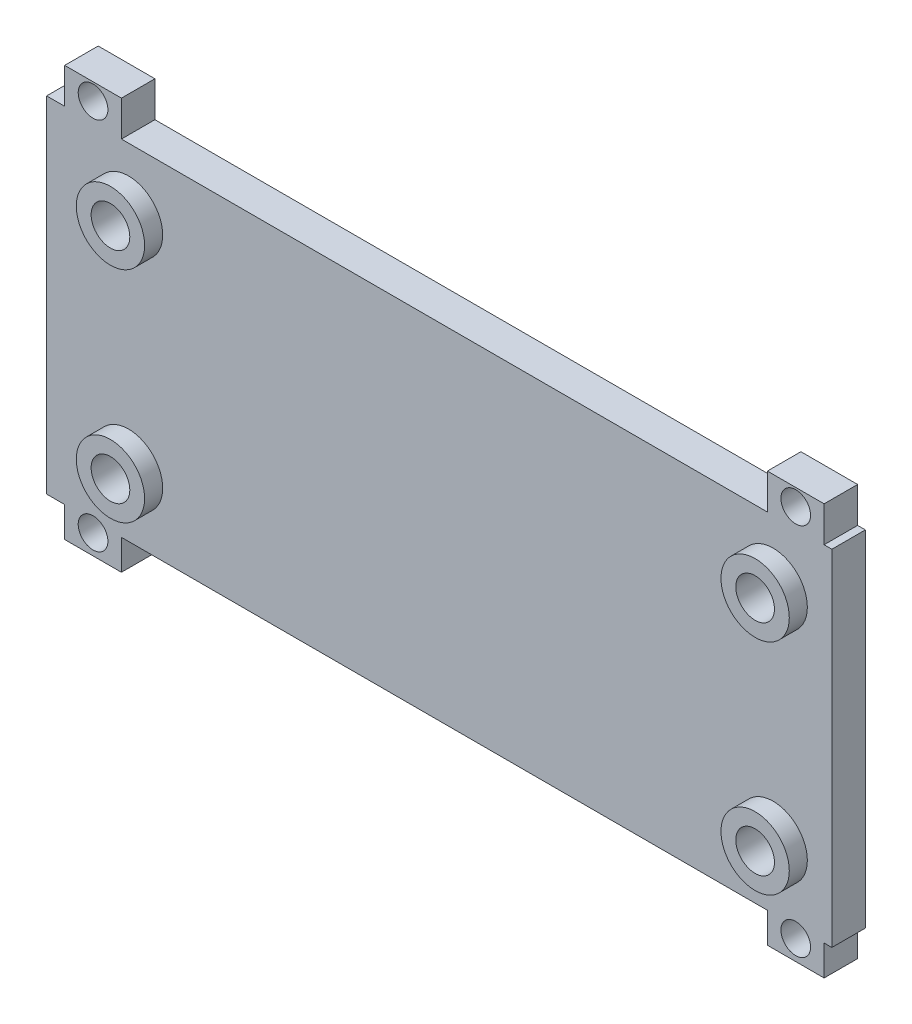
ISO-10303-21;
HEADER;
FILE_DESCRIPTION(('STEP AP214'),'2;1');
FILE_NAME('part.step','',(''),(''),'','','');
FILE_SCHEMA(('AUTOMOTIVE_DESIGN { 1 0 10303 214 1 1 1 1 }'));
ENDSEC;
DATA;
#1=APPLICATION_CONTEXT('core data for automotive mechanical design processes');
#2=APPLICATION_PROTOCOL_DEFINITION('international standard','automotive_design',2000,#1);
#3=PRODUCT_CONTEXT('',#1,'mechanical');
#4=PRODUCT('Part','Part','',(#3));
#5=PRODUCT_RELATED_PRODUCT_CATEGORY('part','',(#4));
#6=PRODUCT_DEFINITION_FORMATION('','',#4);
#7=PRODUCT_DEFINITION_CONTEXT('part definition',#1,'design');
#8=PRODUCT_DEFINITION('design','',#6,#7);
#9=PRODUCT_DEFINITION_SHAPE('','',#8);
#10=(LENGTH_UNIT() NAMED_UNIT(*) SI_UNIT(.MILLI.,.METRE.));
#11=(NAMED_UNIT(*) PLANE_ANGLE_UNIT() SI_UNIT($,.RADIAN.));
#12=(NAMED_UNIT(*) SI_UNIT($,.STERADIAN.) SOLID_ANGLE_UNIT());
#13=UNCERTAINTY_MEASURE_WITH_UNIT(LENGTH_MEASURE(1.E-05),#10,'distance_accuracy_value','');
#14=(GEOMETRIC_REPRESENTATION_CONTEXT(3) GLOBAL_UNCERTAINTY_ASSIGNED_CONTEXT((#13)) GLOBAL_UNIT_ASSIGNED_CONTEXT((#10,
#11,#12)) REPRESENTATION_CONTEXT('',''));
#15=CARTESIAN_POINT('',(0.,0.,0.));
#16=DIRECTION('',(0.,0.,1.));
#17=DIRECTION('',(1.,0.,0.));
#18=AXIS2_PLACEMENT_3D('',#15,#16,#17);
#19=CARTESIAN_POINT('',(0.,0.,2.6));
#20=DIRECTION('',(0.,0.,1.));
#21=DIRECTION('',(1.,0.,0.));
#22=AXIS2_PLACEMENT_3D('',#19,#20,#21);
#23=PLANE('',#22);
#24=CARTESIAN_POINT('',(-36.75,25.9,2.6));
#25=DIRECTION('',(0.,0.,1.));
#26=DIRECTION('',(1.,0.,0.));
#27=AXIS2_PLACEMENT_3D('',#24,#25,#26);
#28=CIRCLE('',#27,2.65);
#29=CARTESIAN_POINT('',(-34.1,25.9,2.6));
#30=VERTEX_POINT('',#29);
#31=EDGE_CURVE('E456',#30,#30,#28,.T.);
#32=ORIENTED_EDGE('',*,*,#31,.F.);
#33=EDGE_LOOP('',(#32));
#34=FACE_BOUND('',#33,.T.);
#35=CARTESIAN_POINT('',(-36.75,8.9,2.6));
#36=DIRECTION('',(0.,0.,1.));
#37=DIRECTION('',(1.,0.,0.));
#38=AXIS2_PLACEMENT_3D('',#35,#36,#37);
#39=CIRCLE('',#38,2.65);
#40=CARTESIAN_POINT('',(-34.1,8.9,2.6));
#41=VERTEX_POINT('',#40);
#42=EDGE_CURVE('E476',#41,#41,#39,.T.);
#43=ORIENTED_EDGE('',*,*,#42,.F.);
#44=EDGE_LOOP('',(#43));
#45=FACE_BOUND('',#44,.T.);
#46=CARTESIAN_POINT('',(-39.5,32.2,2.6));
#47=DIRECTION('',(0.,0.,1.));
#48=DIRECTION('',(1.,0.,0.));
#49=AXIS2_PLACEMENT_3D('',#46,#47,#48);
#50=CIRCLE('',#49,1.15);
#51=CARTESIAN_POINT('',(-38.35,32.2,2.6));
#52=VERTEX_POINT('',#51);
#53=EDGE_CURVE('E501',#52,#52,#50,.T.);
#54=ORIENTED_EDGE('',*,*,#53,.F.);
#55=EDGE_LOOP('',(#54));
#56=FACE_BOUND('',#55,.T.);
#57=CARTESIAN_POINT('',(-39.5,3.2,2.6));
#58=DIRECTION('',(0.,0.,1.));
#59=DIRECTION('',(1.,0.,0.));
#60=AXIS2_PLACEMENT_3D('',#57,#58,#59);
#61=CIRCLE('',#60,1.15);
#62=CARTESIAN_POINT('',(-38.35,3.2,2.6));
#63=VERTEX_POINT('',#62);
#64=EDGE_CURVE('E216',#63,#63,#61,.T.);
#65=ORIENTED_EDGE('',*,*,#64,.F.);
#66=EDGE_LOOP('',(#65));
#67=FACE_BOUND('',#66,.T.);
#68=DIRECTION('',(0.,-1.,0.));
#69=VECTOR('',#68,1.);
#70=CARTESIAN_POINT('',(-43.1,30.75,2.6));
#71=LINE('',#70,#69);
#72=CARTESIAN_POINT('',(-43.1,30.75,2.6));
#73=VERTEX_POINT('',#72);
#74=CARTESIAN_POINT('',(-43.1,4.,2.6));
#75=VERTEX_POINT('',#74);
#76=EDGE_CURVE('E251',#73,#75,#71,.T.);
#77=ORIENTED_EDGE('',*,*,#76,.T.);
#78=DIRECTION('',(1.,0.,0.));
#79=VECTOR('',#78,1.);
#80=CARTESIAN_POINT('',(-43.1,4.,2.6));
#81=LINE('',#80,#79);
#82=CARTESIAN_POINT('',(-41.7,4.,2.6));
#83=VERTEX_POINT('',#82);
#84=EDGE_CURVE('E139',#75,#83,#81,.T.);
#85=ORIENTED_EDGE('',*,*,#84,.T.);
#86=DIRECTION('',(0.,-1.,0.));
#87=VECTOR('',#86,1.);
#88=CARTESIAN_POINT('',(-41.7,4.,2.6));
#89=LINE('',#88,#87);
#90=CARTESIAN_POINT('',(-41.7,1.65,2.6));
#91=VERTEX_POINT('',#90);
#92=EDGE_CURVE('E302',#83,#91,#89,.T.);
#93=ORIENTED_EDGE('',*,*,#92,.T.);
#94=DIRECTION('',(1.,0.,0.));
#95=VECTOR('',#94,1.);
#96=CARTESIAN_POINT('',(-41.7,1.65,2.6));
#97=LINE('',#96,#95);
#98=CARTESIAN_POINT('',(-37.3,1.65,2.6));
#99=VERTEX_POINT('',#98);
#100=EDGE_CURVE('E321',#91,#99,#97,.T.);
#101=ORIENTED_EDGE('',*,*,#100,.T.);
#102=DIRECTION('',(0.,1.,0.));
#103=VECTOR('',#102,1.);
#104=CARTESIAN_POINT('',(-37.3,1.65,2.6));
#105=LINE('',#104,#103);
#106=CARTESIAN_POINT('',(-37.3,4.,2.6));
#107=VERTEX_POINT('',#106);
#108=EDGE_CURVE('E318',#99,#107,#105,.T.);
#109=ORIENTED_EDGE('',*,*,#108,.T.);
#110=DIRECTION('',(1.,0.,0.));
#111=VECTOR('',#110,1.);
#112=CARTESIAN_POINT('',(-37.3,4.,2.6));
#113=LINE('',#112,#111);
#114=CARTESIAN_POINT('',(12.8,4.,2.6));
#115=VERTEX_POINT('',#114);
#116=EDGE_CURVE('E320',#107,#115,#113,.T.);
#117=ORIENTED_EDGE('',*,*,#116,.T.);
#118=DIRECTION('',(0.,-1.,0.));
#119=VECTOR('',#118,1.);
#120=CARTESIAN_POINT('',(12.8,4.,2.6));
#121=LINE('',#120,#119);
#122=CARTESIAN_POINT('',(12.8,1.65,2.6));
#123=VERTEX_POINT('',#122);
#124=EDGE_CURVE('E323',#115,#123,#121,.T.);
#125=ORIENTED_EDGE('',*,*,#124,.T.);
#126=DIRECTION('',(1.,0.,0.));
#127=VECTOR('',#126,1.);
#128=CARTESIAN_POINT('',(12.8,1.65,2.6));
#129=LINE('',#128,#127);
#130=CARTESIAN_POINT('',(17.2,1.65,2.6));
#131=VERTEX_POINT('',#130);
#132=EDGE_CURVE('E329',#123,#131,#129,.T.);
#133=ORIENTED_EDGE('',*,*,#132,.T.);
#134=DIRECTION('',(0.,1.,0.));
#135=VECTOR('',#134,1.);
#136=CARTESIAN_POINT('',(17.2,1.65,2.6));
#137=LINE('',#136,#135);
#138=CARTESIAN_POINT('',(17.2,4.,2.6));
#139=VERTEX_POINT('',#138);
#140=EDGE_CURVE('E331',#131,#139,#137,.T.);
#141=ORIENTED_EDGE('',*,*,#140,.T.);
#142=DIRECTION('',(1.,0.,0.));
#143=VECTOR('',#142,1.);
#144=CARTESIAN_POINT('',(17.2,4.,2.6));
#145=LINE('',#144,#143);
#146=CARTESIAN_POINT('',(17.8,4.,2.6));
#147=VERTEX_POINT('',#146);
#148=EDGE_CURVE('E333',#139,#147,#145,.T.);
#149=ORIENTED_EDGE('',*,*,#148,.T.);
#150=DIRECTION('',(0.,1.,0.));
#151=VECTOR('',#150,1.);
#152=CARTESIAN_POINT('',(17.8,4.,2.6));
#153=LINE('',#152,#151);
#154=CARTESIAN_POINT('',(17.8,30.75,2.6));
#155=VERTEX_POINT('',#154);
#156=EDGE_CURVE('E335',#147,#155,#153,.T.);
#157=ORIENTED_EDGE('',*,*,#156,.T.);
#158=DIRECTION('',(-1.,0.,0.));
#159=VECTOR('',#158,1.);
#160=CARTESIAN_POINT('',(17.8,30.75,2.6));
#161=LINE('',#160,#159);
#162=CARTESIAN_POINT('',(17.2,30.75,2.6));
#163=VERTEX_POINT('',#162);
#164=EDGE_CURVE('E337',#155,#163,#161,.T.);
#165=ORIENTED_EDGE('',*,*,#164,.T.);
#166=DIRECTION('',(0.,1.,0.));
#167=VECTOR('',#166,1.);
#168=CARTESIAN_POINT('',(17.2,30.75,2.6));
#169=LINE('',#168,#167);
#170=CARTESIAN_POINT('',(17.2,33.5,2.6));
#171=VERTEX_POINT('',#170);
#172=EDGE_CURVE('E339',#163,#171,#169,.T.);
#173=ORIENTED_EDGE('',*,*,#172,.T.);
#174=DIRECTION('',(-1.,0.,0.));
#175=VECTOR('',#174,1.);
#176=CARTESIAN_POINT('',(17.2,33.5,2.6));
#177=LINE('',#176,#175);
#178=CARTESIAN_POINT('',(12.8,33.5,2.6));
#179=VERTEX_POINT('',#178);
#180=EDGE_CURVE('E341',#171,#179,#177,.T.);
#181=ORIENTED_EDGE('',*,*,#180,.T.);
#182=DIRECTION('',(0.,-1.,0.));
#183=VECTOR('',#182,1.);
#184=CARTESIAN_POINT('',(12.8,33.5,2.6));
#185=LINE('',#184,#183);
#186=CARTESIAN_POINT('',(12.8,30.75,2.6));
#187=VERTEX_POINT('',#186);
#188=EDGE_CURVE('E343',#179,#187,#185,.T.);
#189=ORIENTED_EDGE('',*,*,#188,.T.);
#190=DIRECTION('',(-1.,0.,0.));
#191=VECTOR('',#190,1.);
#192=CARTESIAN_POINT('',(12.8,30.75,2.6));
#193=LINE('',#192,#191);
#194=CARTESIAN_POINT('',(-37.3,30.75,2.6));
#195=VERTEX_POINT('',#194);
#196=EDGE_CURVE('E345',#187,#195,#193,.T.);
#197=ORIENTED_EDGE('',*,*,#196,.T.);
#198=DIRECTION('',(0.,1.,0.));
#199=VECTOR('',#198,1.);
#200=CARTESIAN_POINT('',(-37.3,30.75,2.6));
#201=LINE('',#200,#199);
#202=CARTESIAN_POINT('',(-37.3,33.5,2.6));
#203=VERTEX_POINT('',#202);
#204=EDGE_CURVE('E194',#195,#203,#201,.T.);
#205=ORIENTED_EDGE('',*,*,#204,.T.);
#206=DIRECTION('',(-1.,0.,0.));
#207=VECTOR('',#206,1.);
#208=CARTESIAN_POINT('',(-37.3,33.5,2.6));
#209=LINE('',#208,#207);
#210=CARTESIAN_POINT('',(-41.7,33.5,2.6));
#211=VERTEX_POINT('',#210);
#212=EDGE_CURVE('E188',#203,#211,#209,.T.);
#213=ORIENTED_EDGE('',*,*,#212,.T.);
#214=DIRECTION('',(0.,-1.,0.));
#215=VECTOR('',#214,1.);
#216=CARTESIAN_POINT('',(-41.7,33.5,2.6));
#217=LINE('',#216,#215);
#218=CARTESIAN_POINT('',(-41.7,30.75,2.6));
#219=VERTEX_POINT('',#218);
#220=EDGE_CURVE('E192',#211,#219,#217,.T.);
#221=ORIENTED_EDGE('',*,*,#220,.T.);
#222=DIRECTION('',(-1.,0.,0.));
#223=VECTOR('',#222,1.);
#224=CARTESIAN_POINT('',(-41.7,30.75,2.6));
#225=LINE('',#224,#223);
#226=EDGE_CURVE('E60',#219,#73,#225,.T.);
#227=ORIENTED_EDGE('',*,*,#226,.T.);
#228=EDGE_LOOP('',(#77,#85,#93,#101,#109,#117,#125,#133,#141,#149,#157,#165,#173,#181,#189,#197,
#205,#213,#221,#227));
#229=FACE_BOUND('',#228,.T.);
#230=CARTESIAN_POINT('',(15.,3.2,2.6));
#231=DIRECTION('',(0.,0.,1.));
#232=DIRECTION('',(1.,0.,0.));
#233=AXIS2_PLACEMENT_3D('',#230,#231,#232);
#234=CIRCLE('',#233,1.15);
#235=CARTESIAN_POINT('',(16.15,3.2,2.6));
#236=VERTEX_POINT('',#235);
#237=EDGE_CURVE('E507',#236,#236,#234,.T.);
#238=ORIENTED_EDGE('',*,*,#237,.F.);
#239=EDGE_LOOP('',(#238));
#240=FACE_BOUND('',#239,.T.);
#241=CARTESIAN_POINT('',(15.,32.2,2.6));
#242=DIRECTION('',(0.,0.,1.));
#243=DIRECTION('',(1.,0.,0.));
#244=AXIS2_PLACEMENT_3D('',#241,#242,#243);
#245=CIRCLE('',#244,1.15);
#246=CARTESIAN_POINT('',(16.15,32.2,2.6));
#247=VERTEX_POINT('',#246);
#248=EDGE_CURVE('E495',#247,#247,#245,.T.);
#249=ORIENTED_EDGE('',*,*,#248,.F.);
#250=EDGE_LOOP('',(#249));
#251=FACE_BOUND('',#250,.T.);
#252=CARTESIAN_POINT('',(13.25,8.9,2.6));
#253=DIRECTION('',(0.,0.,1.));
#254=DIRECTION('',(1.,0.,0.));
#255=AXIS2_PLACEMENT_3D('',#252,#253,#254);
#256=CIRCLE('',#255,2.65);
#257=CARTESIAN_POINT('',(15.9,8.9,2.6));
#258=VERTEX_POINT('',#257);
#259=EDGE_CURVE('E465',#258,#258,#256,.T.);
#260=ORIENTED_EDGE('',*,*,#259,.F.);
#261=EDGE_LOOP('',(#260));
#262=FACE_BOUND('',#261,.T.);
#263=CARTESIAN_POINT('',(13.25,25.9,2.6));
#264=DIRECTION('',(0.,0.,1.));
#265=DIRECTION('',(1.,0.,0.));
#266=AXIS2_PLACEMENT_3D('',#263,#264,#265);
#267=CIRCLE('',#266,2.65);
#268=CARTESIAN_POINT('',(15.9,25.9,2.6));
#269=VERTEX_POINT('',#268);
#270=EDGE_CURVE('E447',#269,#269,#267,.T.);
#271=ORIENTED_EDGE('',*,*,#270,.F.);
#272=EDGE_LOOP('',(#271));
#273=FACE_BOUND('',#272,.T.);
#274=ADVANCED_FACE('F43',(#34,#45,#56,#67,#229,#240,#251,#262,#273),#23,.T.);
#275=CARTESIAN_POINT('',(0.,0.,0.));
#276=DIRECTION('',(0.,0.,1.));
#277=DIRECTION('',(1.,0.,0.));
#278=AXIS2_PLACEMENT_3D('',#275,#276,#277);
#279=PLANE('',#278);
#280=DIRECTION('',(0.,-1.,0.));
#281=VECTOR('',#280,1.);
#282=CARTESIAN_POINT('',(-43.1,30.75,0.));
#283=LINE('',#282,#281);
#284=CARTESIAN_POINT('',(-43.1,30.75,0.));
#285=VERTEX_POINT('',#284);
#286=CARTESIAN_POINT('',(-43.1,4.,0.));
#287=VERTEX_POINT('',#286);
#288=EDGE_CURVE('E212',#285,#287,#283,.T.);
#289=ORIENTED_EDGE('',*,*,#288,.F.);
#290=DIRECTION('',(-1.,0.,0.));
#291=VECTOR('',#290,1.);
#292=CARTESIAN_POINT('',(-41.7,30.75,0.));
#293=LINE('',#292,#291);
#294=CARTESIAN_POINT('',(-41.7,30.75,0.));
#295=VERTEX_POINT('',#294);
#296=EDGE_CURVE('E131',#295,#285,#293,.T.);
#297=ORIENTED_EDGE('',*,*,#296,.F.);
#298=DIRECTION('',(0.,-1.,0.));
#299=VECTOR('',#298,1.);
#300=CARTESIAN_POINT('',(-41.7,33.5,0.));
#301=LINE('',#300,#299);
#302=CARTESIAN_POINT('',(-41.7,33.5,0.));
#303=VERTEX_POINT('',#302);
#304=EDGE_CURVE('E125',#303,#295,#301,.T.);
#305=ORIENTED_EDGE('',*,*,#304,.F.);
#306=DIRECTION('',(-1.,0.,0.));
#307=VECTOR('',#306,1.);
#308=CARTESIAN_POINT('',(-37.3,33.5,0.));
#309=LINE('',#308,#307);
#310=CARTESIAN_POINT('',(-37.3,33.5,0.));
#311=VERTEX_POINT('',#310);
#312=EDGE_CURVE('E202',#311,#303,#309,.T.);
#313=ORIENTED_EDGE('',*,*,#312,.F.);
#314=DIRECTION('',(0.,1.,0.));
#315=VECTOR('',#314,1.);
#316=CARTESIAN_POINT('',(-37.3,30.75,0.));
#317=LINE('',#316,#315);
#318=CARTESIAN_POINT('',(-37.3,30.75,0.));
#319=VERTEX_POINT('',#318);
#320=EDGE_CURVE('E246',#319,#311,#317,.T.);
#321=ORIENTED_EDGE('',*,*,#320,.F.);
#322=DIRECTION('',(-1.,0.,0.));
#323=VECTOR('',#322,1.);
#324=CARTESIAN_POINT('',(12.8,30.75,0.));
#325=LINE('',#324,#323);
#326=CARTESIAN_POINT('',(12.8,30.75,0.));
#327=VERTEX_POINT('',#326);
#328=EDGE_CURVE('E244',#327,#319,#325,.T.);
#329=ORIENTED_EDGE('',*,*,#328,.F.);
#330=DIRECTION('',(0.,-1.,0.));
#331=VECTOR('',#330,1.);
#332=CARTESIAN_POINT('',(12.8,33.5,0.));
#333=LINE('',#332,#331);
#334=CARTESIAN_POINT('',(12.8,33.5,0.));
#335=VERTEX_POINT('',#334);
#336=EDGE_CURVE('E242',#335,#327,#333,.T.);
#337=ORIENTED_EDGE('',*,*,#336,.F.);
#338=DIRECTION('',(-1.,0.,0.));
#339=VECTOR('',#338,1.);
#340=CARTESIAN_POINT('',(17.2,33.5,0.));
#341=LINE('',#340,#339);
#342=CARTESIAN_POINT('',(17.2,33.5,0.));
#343=VERTEX_POINT('',#342);
#344=EDGE_CURVE('E240',#343,#335,#341,.T.);
#345=ORIENTED_EDGE('',*,*,#344,.F.);
#346=DIRECTION('',(0.,1.,0.));
#347=VECTOR('',#346,1.);
#348=CARTESIAN_POINT('',(17.2,30.75,0.));
#349=LINE('',#348,#347);
#350=CARTESIAN_POINT('',(17.2,30.75,0.));
#351=VERTEX_POINT('',#350);
#352=EDGE_CURVE('E238',#351,#343,#349,.T.);
#353=ORIENTED_EDGE('',*,*,#352,.F.);
#354=DIRECTION('',(-1.,0.,0.));
#355=VECTOR('',#354,1.);
#356=CARTESIAN_POINT('',(17.8,30.75,0.));
#357=LINE('',#356,#355);
#358=CARTESIAN_POINT('',(17.8,30.75,0.));
#359=VERTEX_POINT('',#358);
#360=EDGE_CURVE('E236',#359,#351,#357,.T.);
#361=ORIENTED_EDGE('',*,*,#360,.F.);
#362=DIRECTION('',(0.,1.,0.));
#363=VECTOR('',#362,1.);
#364=CARTESIAN_POINT('',(17.8,4.,0.));
#365=LINE('',#364,#363);
#366=CARTESIAN_POINT('',(17.8,4.,0.));
#367=VERTEX_POINT('',#366);
#368=EDGE_CURVE('E234',#367,#359,#365,.T.);
#369=ORIENTED_EDGE('',*,*,#368,.F.);
#370=DIRECTION('',(1.,0.,0.));
#371=VECTOR('',#370,1.);
#372=CARTESIAN_POINT('',(17.2,4.,0.));
#373=LINE('',#372,#371);
#374=CARTESIAN_POINT('',(17.2,4.,0.));
#375=VERTEX_POINT('',#374);
#376=EDGE_CURVE('E232',#375,#367,#373,.T.);
#377=ORIENTED_EDGE('',*,*,#376,.F.);
#378=DIRECTION('',(0.,1.,0.));
#379=VECTOR('',#378,1.);
#380=CARTESIAN_POINT('',(17.2,1.65,0.));
#381=LINE('',#380,#379);
#382=CARTESIAN_POINT('',(17.2,1.65,0.));
#383=VERTEX_POINT('',#382);
#384=EDGE_CURVE('E230',#383,#375,#381,.T.);
#385=ORIENTED_EDGE('',*,*,#384,.F.);
#386=DIRECTION('',(1.,0.,0.));
#387=VECTOR('',#386,1.);
#388=CARTESIAN_POINT('',(12.8,1.65,0.));
#389=LINE('',#388,#387);
#390=CARTESIAN_POINT('',(12.8,1.65,0.));
#391=VERTEX_POINT('',#390);
#392=EDGE_CURVE('E228',#391,#383,#389,.T.);
#393=ORIENTED_EDGE('',*,*,#392,.F.);
#394=DIRECTION('',(0.,-1.,0.));
#395=VECTOR('',#394,1.);
#396=CARTESIAN_POINT('',(12.8,4.,0.));
#397=LINE('',#396,#395);
#398=CARTESIAN_POINT('',(12.8,4.,0.));
#399=VERTEX_POINT('',#398);
#400=EDGE_CURVE('E226',#399,#391,#397,.T.);
#401=ORIENTED_EDGE('',*,*,#400,.F.);
#402=DIRECTION('',(1.,0.,0.));
#403=VECTOR('',#402,1.);
#404=CARTESIAN_POINT('',(-37.3,4.,0.));
#405=LINE('',#404,#403);
#406=CARTESIAN_POINT('',(-37.3,4.,0.));
#407=VERTEX_POINT('',#406);
#408=EDGE_CURVE('E224',#407,#399,#405,.T.);
#409=ORIENTED_EDGE('',*,*,#408,.F.);
#410=DIRECTION('',(0.,1.,0.));
#411=VECTOR('',#410,1.);
#412=CARTESIAN_POINT('',(-37.3,1.65,0.));
#413=LINE('',#412,#411);
#414=CARTESIAN_POINT('',(-37.3,1.65,0.));
#415=VERTEX_POINT('',#414);
#416=EDGE_CURVE('E222',#415,#407,#413,.T.);
#417=ORIENTED_EDGE('',*,*,#416,.F.);
#418=DIRECTION('',(1.,0.,0.));
#419=VECTOR('',#418,1.);
#420=CARTESIAN_POINT('',(-41.7,1.65,0.));
#421=LINE('',#420,#419);
#422=CARTESIAN_POINT('',(-41.7,1.65,0.));
#423=VERTEX_POINT('',#422);
#424=EDGE_CURVE('E220',#423,#415,#421,.T.);
#425=ORIENTED_EDGE('',*,*,#424,.F.);
#426=DIRECTION('',(0.,-1.,0.));
#427=VECTOR('',#426,1.);
#428=CARTESIAN_POINT('',(-41.7,4.,0.));
#429=LINE('',#428,#427);
#430=CARTESIAN_POINT('',(-41.7,4.,0.));
#431=VERTEX_POINT('',#430);
#432=EDGE_CURVE('E218',#431,#423,#429,.T.);
#433=ORIENTED_EDGE('',*,*,#432,.F.);
#434=DIRECTION('',(1.,0.,0.));
#435=VECTOR('',#434,1.);
#436=CARTESIAN_POINT('',(-43.1,4.,0.));
#437=LINE('',#436,#435);
#438=EDGE_CURVE('E215',#287,#431,#437,.T.);
#439=ORIENTED_EDGE('',*,*,#438,.F.);
#440=EDGE_LOOP('',(#289,#297,#305,#313,#321,#329,#337,#345,#353,#361,#369,#377,#385,#393,#401,
#409,#417,#425,#433,#439));
#441=FACE_BOUND('',#440,.T.);
#442=CARTESIAN_POINT('',(-39.5,3.2,0.));
#443=DIRECTION('',(0.,0.,1.));
#444=DIRECTION('',(1.,0.,0.));
#445=AXIS2_PLACEMENT_3D('',#442,#443,#444);
#446=CIRCLE('',#445,1.15);
#447=CARTESIAN_POINT('',(-38.35,3.2,0.));
#448=VERTEX_POINT('',#447);
#449=EDGE_CURVE('E510',#448,#448,#446,.T.);
#450=ORIENTED_EDGE('',*,*,#449,.T.);
#451=EDGE_LOOP('',(#450));
#452=FACE_BOUND('',#451,.T.);
#453=CARTESIAN_POINT('',(15.,3.2,0.));
#454=DIRECTION('',(0.,0.,1.));
#455=DIRECTION('',(1.,0.,0.));
#456=AXIS2_PLACEMENT_3D('',#453,#454,#455);
#457=CIRCLE('',#456,1.15);
#458=CARTESIAN_POINT('',(16.15,3.2,0.));
#459=VERTEX_POINT('',#458);
#460=EDGE_CURVE('E504',#459,#459,#457,.T.);
#461=ORIENTED_EDGE('',*,*,#460,.T.);
#462=EDGE_LOOP('',(#461));
#463=FACE_BOUND('',#462,.T.);
#464=CARTESIAN_POINT('',(-39.5,32.2,0.));
#465=DIRECTION('',(0.,0.,1.));
#466=DIRECTION('',(1.,0.,0.));
#467=AXIS2_PLACEMENT_3D('',#464,#465,#466);
#468=CIRCLE('',#467,1.15);
#469=CARTESIAN_POINT('',(-38.35,32.2,0.));
#470=VERTEX_POINT('',#469);
#471=EDGE_CURVE('E498',#470,#470,#468,.T.);
#472=ORIENTED_EDGE('',*,*,#471,.T.);
#473=EDGE_LOOP('',(#472));
#474=FACE_BOUND('',#473,.T.);
#475=CARTESIAN_POINT('',(15.,32.2,0.));
#476=DIRECTION('',(0.,0.,1.));
#477=DIRECTION('',(1.,0.,0.));
#478=AXIS2_PLACEMENT_3D('',#475,#476,#477);
#479=CIRCLE('',#478,1.15);
#480=CARTESIAN_POINT('',(16.15,32.2,0.));
#481=VERTEX_POINT('',#480);
#482=EDGE_CURVE('E494',#481,#481,#479,.T.);
#483=ORIENTED_EDGE('',*,*,#482,.T.);
#484=EDGE_LOOP('',(#483));
#485=FACE_BOUND('',#484,.T.);
#486=CARTESIAN_POINT('',(-36.75,8.9,0.));
#487=DIRECTION('',(0.,0.,1.));
#488=DIRECTION('',(1.,0.,0.));
#489=AXIS2_PLACEMENT_3D('',#486,#487,#488);
#490=CIRCLE('',#489,1.5);
#491=CARTESIAN_POINT('',(-35.25,8.9,0.));
#492=VERTEX_POINT('',#491);
#493=EDGE_CURVE('E491',#492,#492,#490,.T.);
#494=ORIENTED_EDGE('',*,*,#493,.T.);
#495=EDGE_LOOP('',(#494));
#496=FACE_BOUND('',#495,.T.);
#497=CARTESIAN_POINT('',(13.25,8.9,0.));
#498=DIRECTION('',(0.,0.,1.));
#499=DIRECTION('',(1.,0.,0.));
#500=AXIS2_PLACEMENT_3D('',#497,#498,#499);
#501=CIRCLE('',#500,1.5);
#502=CARTESIAN_POINT('',(14.75,8.9,0.));
#503=VERTEX_POINT('',#502);
#504=EDGE_CURVE('E488',#503,#503,#501,.T.);
#505=ORIENTED_EDGE('',*,*,#504,.T.);
#506=EDGE_LOOP('',(#505));
#507=FACE_BOUND('',#506,.T.);
#508=CARTESIAN_POINT('',(-36.75,25.9,0.));
#509=DIRECTION('',(0.,0.,1.));
#510=DIRECTION('',(1.,0.,0.));
#511=AXIS2_PLACEMENT_3D('',#508,#509,#510);
#512=CIRCLE('',#511,1.5);
#513=CARTESIAN_POINT('',(-35.25,25.9,0.));
#514=VERTEX_POINT('',#513);
#515=EDGE_CURVE('E485',#514,#514,#512,.T.);
#516=ORIENTED_EDGE('',*,*,#515,.T.);
#517=EDGE_LOOP('',(#516));
#518=FACE_BOUND('',#517,.T.);
#519=CARTESIAN_POINT('',(13.25,25.9,0.));
#520=DIRECTION('',(0.,0.,1.));
#521=DIRECTION('',(1.,0.,0.));
#522=AXIS2_PLACEMENT_3D('',#519,#520,#521);
#523=CIRCLE('',#522,1.5);
#524=CARTESIAN_POINT('',(14.75,25.9,0.));
#525=VERTEX_POINT('',#524);
#526=EDGE_CURVE('E480',#525,#525,#523,.T.);
#527=ORIENTED_EDGE('',*,*,#526,.T.);
#528=EDGE_LOOP('',(#527));
#529=FACE_BOUND('',#528,.T.);
#530=ADVANCED_FACE('F306',(#441,#452,#463,#474,#485,#496,#507,#518,#529),#279,.F.);
#531=CARTESIAN_POINT('',(-43.1,30.75,2.6));
#532=DIRECTION('',(1.,0.,0.));
#533=DIRECTION('',(0.,0.,-1.));
#534=AXIS2_PLACEMENT_3D('',#531,#532,#533);
#535=PLANE('',#534);
#536=ORIENTED_EDGE('',*,*,#288,.T.);
#537=DIRECTION('',(0.,0.,-1.));
#538=VECTOR('',#537,1.);
#539=CARTESIAN_POINT('',(-43.1,4.,2.6));
#540=LINE('',#539,#538);
#541=EDGE_CURVE('E11',#75,#287,#540,.T.);
#542=ORIENTED_EDGE('',*,*,#541,.F.);
#543=ORIENTED_EDGE('',*,*,#76,.F.);
#544=DIRECTION('',(0.,0.,-1.));
#545=VECTOR('',#544,1.);
#546=CARTESIAN_POINT('',(-43.1,30.75,2.6));
#547=LINE('',#546,#545);
#548=EDGE_CURVE('E208',#73,#285,#547,.T.);
#549=ORIENTED_EDGE('',*,*,#548,.T.);
#550=EDGE_LOOP('',(#536,#542,#543,#549));
#551=FACE_BOUND('',#550,.T.);
#552=ADVANCED_FACE('F45',(#551),#535,.F.);
#553=CARTESIAN_POINT('',(-43.1,4.,2.6));
#554=DIRECTION('',(0.,1.,0.));
#555=DIRECTION('',(0.,0.,1.));
#556=AXIS2_PLACEMENT_3D('',#553,#554,#555);
#557=PLANE('',#556);
#558=ORIENTED_EDGE('',*,*,#438,.T.);
#559=DIRECTION('',(0.,0.,-1.));
#560=VECTOR('',#559,1.);
#561=CARTESIAN_POINT('',(-41.7,4.,2.6));
#562=LINE('',#561,#560);
#563=EDGE_CURVE('E52',#83,#431,#562,.T.);
#564=ORIENTED_EDGE('',*,*,#563,.F.);
#565=ORIENTED_EDGE('',*,*,#84,.F.);
#566=ORIENTED_EDGE('',*,*,#541,.T.);
#567=EDGE_LOOP('',(#558,#564,#565,#566));
#568=FACE_BOUND('',#567,.T.);
#569=ADVANCED_FACE('F802',(#568),#557,.F.);
#570=CARTESIAN_POINT('',(-41.7,4.,2.6));
#571=DIRECTION('',(1.,0.,0.));
#572=DIRECTION('',(0.,0.,-1.));
#573=AXIS2_PLACEMENT_3D('',#570,#571,#572);
#574=PLANE('',#573);
#575=ORIENTED_EDGE('',*,*,#432,.T.);
#576=DIRECTION('',(0.,0.,-1.));
#577=VECTOR('',#576,1.);
#578=CARTESIAN_POINT('',(-41.7,1.65,2.6));
#579=LINE('',#578,#577);
#580=EDGE_CURVE('E294',#91,#423,#579,.T.);
#581=ORIENTED_EDGE('',*,*,#580,.F.);
#582=ORIENTED_EDGE('',*,*,#92,.F.);
#583=ORIENTED_EDGE('',*,*,#563,.T.);
#584=EDGE_LOOP('',(#575,#581,#582,#583));
#585=FACE_BOUND('',#584,.T.);
#586=ADVANCED_FACE('F300',(#585),#574,.F.);
#587=CARTESIAN_POINT('',(-41.7,1.65,2.6));
#588=DIRECTION('',(0.,1.,0.));
#589=DIRECTION('',(0.,0.,1.));
#590=AXIS2_PLACEMENT_3D('',#587,#588,#589);
#591=PLANE('',#590);
#592=ORIENTED_EDGE('',*,*,#424,.T.);
#593=DIRECTION('',(0.,0.,-1.));
#594=VECTOR('',#593,1.);
#595=CARTESIAN_POINT('',(-37.3,1.65,2.6));
#596=LINE('',#595,#594);
#597=EDGE_CURVE('E291',#99,#415,#596,.T.);
#598=ORIENTED_EDGE('',*,*,#597,.F.);
#599=ORIENTED_EDGE('',*,*,#100,.F.);
#600=ORIENTED_EDGE('',*,*,#580,.T.);
#601=EDGE_LOOP('',(#592,#598,#599,#600));
#602=FACE_BOUND('',#601,.T.);
#603=ADVANCED_FACE('F312',(#602),#591,.F.);
#604=CARTESIAN_POINT('',(-37.3,1.65,2.6));
#605=DIRECTION('',(-1.,0.,0.));
#606=DIRECTION('',(0.,0.,1.));
#607=AXIS2_PLACEMENT_3D('',#604,#605,#606);
#608=PLANE('',#607);
#609=ORIENTED_EDGE('',*,*,#416,.T.);
#610=DIRECTION('',(0.,0.,-1.));
#611=VECTOR('',#610,1.);
#612=CARTESIAN_POINT('',(-37.3,4.,2.6));
#613=LINE('',#612,#611);
#614=EDGE_CURVE('E288',#107,#407,#613,.T.);
#615=ORIENTED_EDGE('',*,*,#614,.F.);
#616=ORIENTED_EDGE('',*,*,#108,.F.);
#617=ORIENTED_EDGE('',*,*,#597,.T.);
#618=EDGE_LOOP('',(#609,#615,#616,#617));
#619=FACE_BOUND('',#618,.T.);
#620=ADVANCED_FACE('F316',(#619),#608,.F.);
#621=CARTESIAN_POINT('',(-37.3,4.,2.6));
#622=DIRECTION('',(0.,1.,0.));
#623=DIRECTION('',(0.,0.,1.));
#624=AXIS2_PLACEMENT_3D('',#621,#622,#623);
#625=PLANE('',#624);
#626=ORIENTED_EDGE('',*,*,#408,.T.);
#627=DIRECTION('',(0.,0.,-1.));
#628=VECTOR('',#627,1.);
#629=CARTESIAN_POINT('',(12.8,4.,2.6));
#630=LINE('',#629,#628);
#631=EDGE_CURVE('E285',#115,#399,#630,.T.);
#632=ORIENTED_EDGE('',*,*,#631,.F.);
#633=ORIENTED_EDGE('',*,*,#116,.F.);
#634=ORIENTED_EDGE('',*,*,#614,.T.);
#635=EDGE_LOOP('',(#626,#632,#633,#634));
#636=FACE_BOUND('',#635,.T.);
#637=ADVANCED_FACE('F771',(#636),#625,.F.);
#638=CARTESIAN_POINT('',(12.8,4.,2.6));
#639=DIRECTION('',(1.,0.,0.));
#640=DIRECTION('',(0.,0.,-1.));
#641=AXIS2_PLACEMENT_3D('',#638,#639,#640);
#642=PLANE('',#641);
#643=ORIENTED_EDGE('',*,*,#400,.T.);
#644=DIRECTION('',(0.,0.,-1.));
#645=VECTOR('',#644,1.);
#646=CARTESIAN_POINT('',(12.8,1.65,2.6));
#647=LINE('',#646,#645);
#648=EDGE_CURVE('E282',#123,#391,#647,.T.);
#649=ORIENTED_EDGE('',*,*,#648,.F.);
#650=ORIENTED_EDGE('',*,*,#124,.F.);
#651=ORIENTED_EDGE('',*,*,#631,.T.);
#652=EDGE_LOOP('',(#643,#649,#650,#651));
#653=FACE_BOUND('',#652,.T.);
#654=ADVANCED_FACE('F762',(#653),#642,.F.);
#655=CARTESIAN_POINT('',(12.8,1.65,2.6));
#656=DIRECTION('',(0.,1.,0.));
#657=DIRECTION('',(0.,0.,1.));
#658=AXIS2_PLACEMENT_3D('',#655,#656,#657);
#659=PLANE('',#658);
#660=ORIENTED_EDGE('',*,*,#392,.T.);
#661=DIRECTION('',(0.,0.,-1.));
#662=VECTOR('',#661,1.);
#663=CARTESIAN_POINT('',(17.2,1.65,2.6));
#664=LINE('',#663,#662);
#665=EDGE_CURVE('E279',#131,#383,#664,.T.);
#666=ORIENTED_EDGE('',*,*,#665,.F.);
#667=ORIENTED_EDGE('',*,*,#132,.F.);
#668=ORIENTED_EDGE('',*,*,#648,.T.);
#669=EDGE_LOOP('',(#660,#666,#667,#668));
#670=FACE_BOUND('',#669,.T.);
#671=ADVANCED_FACE('F753',(#670),#659,.F.);
#672=CARTESIAN_POINT('',(17.2,1.65,2.6));
#673=DIRECTION('',(-1.,0.,0.));
#674=DIRECTION('',(0.,0.,1.));
#675=AXIS2_PLACEMENT_3D('',#672,#673,#674);
#676=PLANE('',#675);
#677=ORIENTED_EDGE('',*,*,#384,.T.);
#678=DIRECTION('',(0.,0.,-1.));
#679=VECTOR('',#678,1.);
#680=CARTESIAN_POINT('',(17.2,4.,2.6));
#681=LINE('',#680,#679);
#682=EDGE_CURVE('E276',#139,#375,#681,.T.);
#683=ORIENTED_EDGE('',*,*,#682,.F.);
#684=ORIENTED_EDGE('',*,*,#140,.F.);
#685=ORIENTED_EDGE('',*,*,#665,.T.);
#686=EDGE_LOOP('',(#677,#683,#684,#685));
#687=FACE_BOUND('',#686,.T.);
#688=ADVANCED_FACE('F744',(#687),#676,.F.);
#689=CARTESIAN_POINT('',(17.2,4.,2.6));
#690=DIRECTION('',(0.,1.,0.));
#691=DIRECTION('',(0.,0.,1.));
#692=AXIS2_PLACEMENT_3D('',#689,#690,#691);
#693=PLANE('',#692);
#694=ORIENTED_EDGE('',*,*,#376,.T.);
#695=DIRECTION('',(0.,0.,-1.));
#696=VECTOR('',#695,1.);
#697=CARTESIAN_POINT('',(17.8,4.,2.6));
#698=LINE('',#697,#696);
#699=EDGE_CURVE('E273',#147,#367,#698,.T.);
#700=ORIENTED_EDGE('',*,*,#699,.F.);
#701=ORIENTED_EDGE('',*,*,#148,.F.);
#702=ORIENTED_EDGE('',*,*,#682,.T.);
#703=EDGE_LOOP('',(#694,#700,#701,#702));
#704=FACE_BOUND('',#703,.T.);
#705=ADVANCED_FACE('F735',(#704),#693,.F.);
#706=CARTESIAN_POINT('',(17.8,4.,2.6));
#707=DIRECTION('',(-1.,0.,0.));
#708=DIRECTION('',(0.,0.,1.));
#709=AXIS2_PLACEMENT_3D('',#706,#707,#708);
#710=PLANE('',#709);
#711=ORIENTED_EDGE('',*,*,#368,.T.);
#712=DIRECTION('',(0.,0.,-1.));
#713=VECTOR('',#712,1.);
#714=CARTESIAN_POINT('',(17.8,30.75,2.6));
#715=LINE('',#714,#713);
#716=EDGE_CURVE('E270',#155,#359,#715,.T.);
#717=ORIENTED_EDGE('',*,*,#716,.F.);
#718=ORIENTED_EDGE('',*,*,#156,.F.);
#719=ORIENTED_EDGE('',*,*,#699,.T.);
#720=EDGE_LOOP('',(#711,#717,#718,#719));
#721=FACE_BOUND('',#720,.T.);
#722=ADVANCED_FACE('F726',(#721),#710,.F.);
#723=CARTESIAN_POINT('',(17.8,30.75,2.6));
#724=DIRECTION('',(0.,-1.,0.));
#725=DIRECTION('',(0.,0.,-1.));
#726=AXIS2_PLACEMENT_3D('',#723,#724,#725);
#727=PLANE('',#726);
#728=ORIENTED_EDGE('',*,*,#360,.T.);
#729=DIRECTION('',(0.,0.,-1.));
#730=VECTOR('',#729,1.);
#731=CARTESIAN_POINT('',(17.2,30.75,2.6));
#732=LINE('',#731,#730);
#733=EDGE_CURVE('E267',#163,#351,#732,.T.);
#734=ORIENTED_EDGE('',*,*,#733,.F.);
#735=ORIENTED_EDGE('',*,*,#164,.F.);
#736=ORIENTED_EDGE('',*,*,#716,.T.);
#737=EDGE_LOOP('',(#728,#734,#735,#736));
#738=FACE_BOUND('',#737,.T.);
#739=ADVANCED_FACE('F717',(#738),#727,.F.);
#740=CARTESIAN_POINT('',(17.2,30.75,2.6));
#741=DIRECTION('',(-1.,0.,0.));
#742=DIRECTION('',(0.,0.,1.));
#743=AXIS2_PLACEMENT_3D('',#740,#741,#742);
#744=PLANE('',#743);
#745=ORIENTED_EDGE('',*,*,#352,.T.);
#746=DIRECTION('',(0.,0.,-1.));
#747=VECTOR('',#746,1.);
#748=CARTESIAN_POINT('',(17.2,33.5,2.6));
#749=LINE('',#748,#747);
#750=EDGE_CURVE('E264',#171,#343,#749,.T.);
#751=ORIENTED_EDGE('',*,*,#750,.F.);
#752=ORIENTED_EDGE('',*,*,#172,.F.);
#753=ORIENTED_EDGE('',*,*,#733,.T.);
#754=EDGE_LOOP('',(#745,#751,#752,#753));
#755=FACE_BOUND('',#754,.T.);
#756=ADVANCED_FACE('F708',(#755),#744,.F.);
#757=CARTESIAN_POINT('',(17.2,33.5,2.6));
#758=DIRECTION('',(0.,-1.,0.));
#759=DIRECTION('',(0.,0.,-1.));
#760=AXIS2_PLACEMENT_3D('',#757,#758,#759);
#761=PLANE('',#760);
#762=ORIENTED_EDGE('',*,*,#344,.T.);
#763=DIRECTION('',(0.,0.,-1.));
#764=VECTOR('',#763,1.);
#765=CARTESIAN_POINT('',(12.8,33.5,2.6));
#766=LINE('',#765,#764);
#767=EDGE_CURVE('E261',#179,#335,#766,.T.);
#768=ORIENTED_EDGE('',*,*,#767,.F.);
#769=ORIENTED_EDGE('',*,*,#180,.F.);
#770=ORIENTED_EDGE('',*,*,#750,.T.);
#771=EDGE_LOOP('',(#762,#768,#769,#770));
#772=FACE_BOUND('',#771,.T.);
#773=ADVANCED_FACE('F699',(#772),#761,.F.);
#774=CARTESIAN_POINT('',(12.8,33.5,2.6));
#775=DIRECTION('',(1.,0.,0.));
#776=DIRECTION('',(0.,0.,-1.));
#777=AXIS2_PLACEMENT_3D('',#774,#775,#776);
#778=PLANE('',#777);
#779=ORIENTED_EDGE('',*,*,#336,.T.);
#780=DIRECTION('',(0.,0.,-1.));
#781=VECTOR('',#780,1.);
#782=CARTESIAN_POINT('',(12.8,30.75,2.6));
#783=LINE('',#782,#781);
#784=EDGE_CURVE('E258',#187,#327,#783,.T.);
#785=ORIENTED_EDGE('',*,*,#784,.F.);
#786=ORIENTED_EDGE('',*,*,#188,.F.);
#787=ORIENTED_EDGE('',*,*,#767,.T.);
#788=EDGE_LOOP('',(#779,#785,#786,#787));
#789=FACE_BOUND('',#788,.T.);
#790=ADVANCED_FACE('F691',(#789),#778,.F.);
#791=CARTESIAN_POINT('',(12.8,30.75,2.6));
#792=DIRECTION('',(0.,-1.,0.));
#793=DIRECTION('',(0.,0.,-1.));
#794=AXIS2_PLACEMENT_3D('',#791,#792,#793);
#795=PLANE('',#794);
#796=ORIENTED_EDGE('',*,*,#328,.T.);
#797=DIRECTION('',(0.,0.,-1.));
#798=VECTOR('',#797,1.);
#799=CARTESIAN_POINT('',(-37.3,30.75,2.6));
#800=LINE('',#799,#798);
#801=EDGE_CURVE('E255',#195,#319,#800,.T.);
#802=ORIENTED_EDGE('',*,*,#801,.F.);
#803=ORIENTED_EDGE('',*,*,#196,.F.);
#804=ORIENTED_EDGE('',*,*,#784,.T.);
#805=EDGE_LOOP('',(#796,#802,#803,#804));
#806=FACE_BOUND('',#805,.T.);
#807=ADVANCED_FACE('F351',(#806),#795,.F.);
#808=CARTESIAN_POINT('',(-37.3,30.75,2.6));
#809=DIRECTION('',(-1.,0.,0.));
#810=DIRECTION('',(0.,0.,1.));
#811=AXIS2_PLACEMENT_3D('',#808,#809,#810);
#812=PLANE('',#811);
#813=ORIENTED_EDGE('',*,*,#320,.T.);
#814=DIRECTION('',(0.,0.,-1.));
#815=VECTOR('',#814,1.);
#816=CARTESIAN_POINT('',(-37.3,33.5,2.6));
#817=LINE('',#816,#815);
#818=EDGE_CURVE('E203',#203,#311,#817,.T.);
#819=ORIENTED_EDGE('',*,*,#818,.F.);
#820=ORIENTED_EDGE('',*,*,#204,.F.);
#821=ORIENTED_EDGE('',*,*,#801,.T.);
#822=EDGE_LOOP('',(#813,#819,#820,#821));
#823=FACE_BOUND('',#822,.T.);
#824=ADVANCED_FACE('F355',(#823),#812,.F.);
#825=CARTESIAN_POINT('',(-37.3,33.5,2.6));
#826=DIRECTION('',(0.,-1.,0.));
#827=DIRECTION('',(0.,0.,-1.));
#828=AXIS2_PLACEMENT_3D('',#825,#826,#827);
#829=PLANE('',#828);
#830=ORIENTED_EDGE('',*,*,#312,.T.);
#831=DIRECTION('',(0.,0.,-1.));
#832=VECTOR('',#831,1.);
#833=CARTESIAN_POINT('',(-41.7,33.5,2.6));
#834=LINE('',#833,#832);
#835=EDGE_CURVE('E199',#211,#303,#834,.T.);
#836=ORIENTED_EDGE('',*,*,#835,.F.);
#837=ORIENTED_EDGE('',*,*,#212,.F.);
#838=ORIENTED_EDGE('',*,*,#818,.T.);
#839=EDGE_LOOP('',(#830,#836,#837,#838));
#840=FACE_BOUND('',#839,.T.);
#841=ADVANCED_FACE('F200',(#840),#829,.F.);
#842=CARTESIAN_POINT('',(-41.7,33.5,2.6));
#843=DIRECTION('',(1.,0.,0.));
#844=DIRECTION('',(0.,0.,-1.));
#845=AXIS2_PLACEMENT_3D('',#842,#843,#844);
#846=PLANE('',#845);
#847=ORIENTED_EDGE('',*,*,#304,.T.);
#848=DIRECTION('',(0.,0.,-1.));
#849=VECTOR('',#848,1.);
#850=CARTESIAN_POINT('',(-41.7,30.75,2.6));
#851=LINE('',#850,#849);
#852=EDGE_CURVE('E204',#219,#295,#851,.T.);
#853=ORIENTED_EDGE('',*,*,#852,.F.);
#854=ORIENTED_EDGE('',*,*,#220,.F.);
#855=ORIENTED_EDGE('',*,*,#835,.T.);
#856=EDGE_LOOP('',(#847,#853,#854,#855));
#857=FACE_BOUND('',#856,.T.);
#858=ADVANCED_FACE('F206',(#857),#846,.F.);
#859=CARTESIAN_POINT('',(-41.7,30.75,2.6));
#860=DIRECTION('',(0.,-1.,0.));
#861=DIRECTION('',(0.,0.,-1.));
#862=AXIS2_PLACEMENT_3D('',#859,#860,#861);
#863=PLANE('',#862);
#864=ORIENTED_EDGE('',*,*,#296,.T.);
#865=ORIENTED_EDGE('',*,*,#548,.F.);
#866=ORIENTED_EDGE('',*,*,#226,.F.);
#867=ORIENTED_EDGE('',*,*,#852,.T.);
#868=EDGE_LOOP('',(#864,#865,#866,#867));
#869=FACE_BOUND('',#868,.T.);
#870=ADVANCED_FACE('F359',(#869),#863,.F.);
#871=CARTESIAN_POINT('',(-39.5,3.2,2.6));
#872=DIRECTION('',(0.,0.,-1.));
#873=DIRECTION('',(-1.,0.,0.));
#874=AXIS2_PLACEMENT_3D('',#871,#872,#873);
#875=CYLINDRICAL_SURFACE('',#874,1.15);
#876=ORIENTED_EDGE('',*,*,#64,.T.);
#877=EDGE_LOOP('',(#876));
#878=FACE_BOUND('',#877,.T.);
#879=ORIENTED_EDGE('',*,*,#449,.F.);
#880=EDGE_LOOP('',(#879));
#881=FACE_BOUND('',#880,.T.);
#882=ADVANCED_FACE('F361',(#878,#881),#875,.F.);
#883=CARTESIAN_POINT('',(15.,3.2,2.6));
#884=DIRECTION('',(0.,0.,-1.));
#885=DIRECTION('',(-1.,0.,0.));
#886=AXIS2_PLACEMENT_3D('',#883,#884,#885);
#887=CYLINDRICAL_SURFACE('',#886,1.15);
#888=ORIENTED_EDGE('',*,*,#237,.T.);
#889=EDGE_LOOP('',(#888));
#890=FACE_BOUND('',#889,.T.);
#891=ORIENTED_EDGE('',*,*,#460,.F.);
#892=EDGE_LOOP('',(#891));
#893=FACE_BOUND('',#892,.T.);
#894=ADVANCED_FACE('F367',(#890,#893),#887,.F.);
#895=CARTESIAN_POINT('',(-39.5,32.2,2.6));
#896=DIRECTION('',(0.,0.,-1.));
#897=DIRECTION('',(-1.,0.,0.));
#898=AXIS2_PLACEMENT_3D('',#895,#896,#897);
#899=CYLINDRICAL_SURFACE('',#898,1.15);
#900=ORIENTED_EDGE('',*,*,#53,.T.);
#901=EDGE_LOOP('',(#900));
#902=FACE_BOUND('',#901,.T.);
#903=ORIENTED_EDGE('',*,*,#471,.F.);
#904=EDGE_LOOP('',(#903));
#905=FACE_BOUND('',#904,.T.);
#906=ADVANCED_FACE('F385',(#902,#905),#899,.F.);
#907=CARTESIAN_POINT('',(15.,32.2,2.6));
#908=DIRECTION('',(0.,0.,-1.));
#909=DIRECTION('',(-1.,0.,0.));
#910=AXIS2_PLACEMENT_3D('',#907,#908,#909);
#911=CYLINDRICAL_SURFACE('',#910,1.15);
#912=ORIENTED_EDGE('',*,*,#248,.T.);
#913=EDGE_LOOP('',(#912));
#914=FACE_BOUND('',#913,.T.);
#915=ORIENTED_EDGE('',*,*,#482,.F.);
#916=EDGE_LOOP('',(#915));
#917=FACE_BOUND('',#916,.T.);
#918=ADVANCED_FACE('F389',(#914,#917),#911,.F.);
#919=CARTESIAN_POINT('',(-36.75,8.9,2.6));
#920=DIRECTION('',(0.,0.,-1.));
#921=DIRECTION('',(-1.,0.,0.));
#922=AXIS2_PLACEMENT_3D('',#919,#920,#921);
#923=CYLINDRICAL_SURFACE('',#922,1.5);
#924=ORIENTED_EDGE('',*,*,#493,.F.);
#925=EDGE_LOOP('',(#924));
#926=FACE_BOUND('',#925,.T.);
#927=CARTESIAN_POINT('',(-36.75,8.9,4.));
#928=DIRECTION('',(0.,0.,1.));
#929=DIRECTION('',(1.,0.,0.));
#930=AXIS2_PLACEMENT_3D('',#927,#928,#929);
#931=CIRCLE('',#930,1.5);
#932=CARTESIAN_POINT('',(-35.25,8.9,4.));
#933=VERTEX_POINT('',#932);
#934=EDGE_CURVE('E473',#933,#933,#931,.T.);
#935=ORIENTED_EDGE('',*,*,#934,.T.);
#936=EDGE_LOOP('',(#935));
#937=FACE_BOUND('',#936,.T.);
#938=ADVANCED_FACE('F392',(#926,#937),#923,.F.);
#939=CARTESIAN_POINT('',(13.25,8.9,2.6));
#940=DIRECTION('',(0.,0.,-1.));
#941=DIRECTION('',(-1.,0.,0.));
#942=AXIS2_PLACEMENT_3D('',#939,#940,#941);
#943=CYLINDRICAL_SURFACE('',#942,1.5);
#944=ORIENTED_EDGE('',*,*,#504,.F.);
#945=EDGE_LOOP('',(#944));
#946=FACE_BOUND('',#945,.T.);
#947=CARTESIAN_POINT('',(13.25,8.9,4.));
#948=DIRECTION('',(0.,0.,1.));
#949=DIRECTION('',(1.,0.,0.));
#950=AXIS2_PLACEMENT_3D('',#947,#948,#949);
#951=CIRCLE('',#950,1.5);
#952=CARTESIAN_POINT('',(14.75,8.9,4.));
#953=VERTEX_POINT('',#952);
#954=EDGE_CURVE('E468',#953,#953,#951,.T.);
#955=ORIENTED_EDGE('',*,*,#954,.T.);
#956=EDGE_LOOP('',(#955));
#957=FACE_BOUND('',#956,.T.);
#958=ADVANCED_FACE('F395',(#946,#957),#943,.F.);
#959=CARTESIAN_POINT('',(-36.75,25.9,2.6));
#960=DIRECTION('',(0.,0.,-1.));
#961=DIRECTION('',(-1.,0.,0.));
#962=AXIS2_PLACEMENT_3D('',#959,#960,#961);
#963=CYLINDRICAL_SURFACE('',#962,1.5);
#964=ORIENTED_EDGE('',*,*,#515,.F.);
#965=EDGE_LOOP('',(#964));
#966=FACE_BOUND('',#965,.T.);
#967=CARTESIAN_POINT('',(-36.75,25.9,4.));
#968=DIRECTION('',(0.,0.,1.));
#969=DIRECTION('',(1.,0.,0.));
#970=AXIS2_PLACEMENT_3D('',#967,#968,#969);
#971=CIRCLE('',#970,1.5);
#972=CARTESIAN_POINT('',(-35.25,25.9,4.));
#973=VERTEX_POINT('',#972);
#974=EDGE_CURVE('E459',#973,#973,#971,.T.);
#975=ORIENTED_EDGE('',*,*,#974,.T.);
#976=EDGE_LOOP('',(#975));
#977=FACE_BOUND('',#976,.T.);
#978=ADVANCED_FACE('F399',(#966,#977),#963,.F.);
#979=CARTESIAN_POINT('',(13.25,25.9,2.6));
#980=DIRECTION('',(0.,0.,-1.));
#981=DIRECTION('',(-1.,0.,0.));
#982=AXIS2_PLACEMENT_3D('',#979,#980,#981);
#983=CYLINDRICAL_SURFACE('',#982,1.5);
#984=ORIENTED_EDGE('',*,*,#526,.F.);
#985=EDGE_LOOP('',(#984));
#986=FACE_BOUND('',#985,.T.);
#987=CARTESIAN_POINT('',(13.25,25.9,4.));
#988=DIRECTION('',(0.,0.,1.));
#989=DIRECTION('',(1.,0.,0.));
#990=AXIS2_PLACEMENT_3D('',#987,#988,#989);
#991=CIRCLE('',#990,1.5);
#992=CARTESIAN_POINT('',(14.75,25.9,4.));
#993=VERTEX_POINT('',#992);
#994=EDGE_CURVE('E449',#993,#993,#991,.T.);
#995=ORIENTED_EDGE('',*,*,#994,.T.);
#996=EDGE_LOOP('',(#995));
#997=FACE_BOUND('',#996,.T.);
#998=ADVANCED_FACE('F403',(#986,#997),#983,.F.);
#999=CARTESIAN_POINT('',(-36.75,8.9,4.));
#1000=DIRECTION('',(0.,0.,1.));
#1001=DIRECTION('',(1.,0.,0.));
#1002=AXIS2_PLACEMENT_3D('',#999,#1000,#1001);
#1003=PLANE('',#1002);
#1004=CARTESIAN_POINT('',(-36.75,8.9,4.));
#1005=DIRECTION('',(0.,0.,1.));
#1006=DIRECTION('',(1.,0.,0.));
#1007=AXIS2_PLACEMENT_3D('',#1004,#1005,#1006);
#1008=CIRCLE('',#1007,2.65);
#1009=CARTESIAN_POINT('',(-34.1,8.9,4.));
#1010=VERTEX_POINT('',#1009);
#1011=EDGE_CURVE('E477',#1010,#1010,#1008,.T.);
#1012=ORIENTED_EDGE('',*,*,#1011,.T.);
#1013=EDGE_LOOP('',(#1012));
#1014=FACE_BOUND('',#1013,.T.);
#1015=ORIENTED_EDGE('',*,*,#934,.F.);
#1016=EDGE_LOOP('',(#1015));
#1017=FACE_BOUND('',#1016,.T.);
#1018=ADVANCED_FACE('F407',(#1014,#1017),#1003,.T.);
#1019=CARTESIAN_POINT('',(-36.75,8.9,4.));
#1020=DIRECTION('',(0.,0.,-1.));
#1021=DIRECTION('',(-1.,0.,0.));
#1022=AXIS2_PLACEMENT_3D('',#1019,#1020,#1021);
#1023=CYLINDRICAL_SURFACE('',#1022,2.65);
#1024=ORIENTED_EDGE('',*,*,#1011,.F.);
#1025=EDGE_LOOP('',(#1024));
#1026=FACE_BOUND('',#1025,.T.);
#1027=ORIENTED_EDGE('',*,*,#42,.T.);
#1028=EDGE_LOOP('',(#1027));
#1029=FACE_BOUND('',#1028,.T.);
#1030=ADVANCED_FACE('F409',(#1026,#1029),#1023,.T.);
#1031=CARTESIAN_POINT('',(13.25,8.9,4.));
#1032=DIRECTION('',(0.,0.,1.));
#1033=DIRECTION('',(1.,0.,0.));
#1034=AXIS2_PLACEMENT_3D('',#1031,#1032,#1033);
#1035=PLANE('',#1034);
#1036=CARTESIAN_POINT('',(13.25,8.9,4.));
#1037=DIRECTION('',(0.,0.,1.));
#1038=DIRECTION('',(1.,0.,0.));
#1039=AXIS2_PLACEMENT_3D('',#1036,#1037,#1038);
#1040=CIRCLE('',#1039,2.65);
#1041=CARTESIAN_POINT('',(15.9,8.9,4.));
#1042=VERTEX_POINT('',#1041);
#1043=EDGE_CURVE('E464',#1042,#1042,#1040,.T.);
#1044=ORIENTED_EDGE('',*,*,#1043,.T.);
#1045=EDGE_LOOP('',(#1044));
#1046=FACE_BOUND('',#1045,.T.);
#1047=ORIENTED_EDGE('',*,*,#954,.F.);
#1048=EDGE_LOOP('',(#1047));
#1049=FACE_BOUND('',#1048,.T.);
#1050=ADVANCED_FACE('F412',(#1046,#1049),#1035,.T.);
#1051=CARTESIAN_POINT('',(13.25,8.9,4.));
#1052=DIRECTION('',(0.,0.,-1.));
#1053=DIRECTION('',(-1.,0.,0.));
#1054=AXIS2_PLACEMENT_3D('',#1051,#1052,#1053);
#1055=CYLINDRICAL_SURFACE('',#1054,2.65);
#1056=ORIENTED_EDGE('',*,*,#1043,.F.);
#1057=EDGE_LOOP('',(#1056));
#1058=FACE_BOUND('',#1057,.T.);
#1059=ORIENTED_EDGE('',*,*,#259,.T.);
#1060=EDGE_LOOP('',(#1059));
#1061=FACE_BOUND('',#1060,.T.);
#1062=ADVANCED_FACE('F419',(#1058,#1061),#1055,.T.);
#1063=CARTESIAN_POINT('',(-36.75,25.9,4.));
#1064=DIRECTION('',(0.,0.,1.));
#1065=DIRECTION('',(1.,0.,0.));
#1066=AXIS2_PLACEMENT_3D('',#1063,#1064,#1065);
#1067=PLANE('',#1066);
#1068=CARTESIAN_POINT('',(-36.75,25.9,4.));
#1069=DIRECTION('',(0.,0.,1.));
#1070=DIRECTION('',(1.,0.,0.));
#1071=AXIS2_PLACEMENT_3D('',#1068,#1069,#1070);
#1072=CIRCLE('',#1071,2.65);
#1073=CARTESIAN_POINT('',(-34.1,25.9,4.));
#1074=VERTEX_POINT('',#1073);
#1075=EDGE_CURVE('E452',#1074,#1074,#1072,.T.);
#1076=ORIENTED_EDGE('',*,*,#1075,.T.);
#1077=EDGE_LOOP('',(#1076));
#1078=FACE_BOUND('',#1077,.T.);
#1079=ORIENTED_EDGE('',*,*,#974,.F.);
#1080=EDGE_LOOP('',(#1079));
#1081=FACE_BOUND('',#1080,.T.);
#1082=ADVANCED_FACE('F423',(#1078,#1081),#1067,.T.);
#1083=CARTESIAN_POINT('',(-36.75,25.9,4.));
#1084=DIRECTION('',(0.,0.,-1.));
#1085=DIRECTION('',(-1.,0.,0.));
#1086=AXIS2_PLACEMENT_3D('',#1083,#1084,#1085);
#1087=CYLINDRICAL_SURFACE('',#1086,2.65);
#1088=ORIENTED_EDGE('',*,*,#1075,.F.);
#1089=EDGE_LOOP('',(#1088));
#1090=FACE_BOUND('',#1089,.T.);
#1091=ORIENTED_EDGE('',*,*,#31,.T.);
#1092=EDGE_LOOP('',(#1091));
#1093=FACE_BOUND('',#1092,.T.);
#1094=ADVANCED_FACE('F427',(#1090,#1093),#1087,.T.);
#1095=CARTESIAN_POINT('',(13.25,25.9,4.));
#1096=DIRECTION('',(0.,0.,1.));
#1097=DIRECTION('',(1.,0.,0.));
#1098=AXIS2_PLACEMENT_3D('',#1095,#1096,#1097);
#1099=PLANE('',#1098);
#1100=CARTESIAN_POINT('',(13.25,25.9,4.));
#1101=DIRECTION('',(0.,0.,1.));
#1102=DIRECTION('',(1.,0.,0.));
#1103=AXIS2_PLACEMENT_3D('',#1100,#1101,#1102);
#1104=CIRCLE('',#1103,2.65);
#1105=CARTESIAN_POINT('',(15.9,25.9,4.));
#1106=VERTEX_POINT('',#1105);
#1107=EDGE_CURVE('E444',#1106,#1106,#1104,.T.);
#1108=ORIENTED_EDGE('',*,*,#1107,.T.);
#1109=EDGE_LOOP('',(#1108));
#1110=FACE_BOUND('',#1109,.T.);
#1111=ORIENTED_EDGE('',*,*,#994,.F.);
#1112=EDGE_LOOP('',(#1111));
#1113=FACE_BOUND('',#1112,.T.);
#1114=ADVANCED_FACE('F431',(#1110,#1113),#1099,.T.);
#1115=CARTESIAN_POINT('',(13.25,25.9,4.));
#1116=DIRECTION('',(0.,0.,-1.));
#1117=DIRECTION('',(-1.,0.,0.));
#1118=AXIS2_PLACEMENT_3D('',#1115,#1116,#1117);
#1119=CYLINDRICAL_SURFACE('',#1118,2.65);
#1120=ORIENTED_EDGE('',*,*,#1107,.F.);
#1121=EDGE_LOOP('',(#1120));
#1122=FACE_BOUND('',#1121,.T.);
#1123=ORIENTED_EDGE('',*,*,#270,.T.);
#1124=EDGE_LOOP('',(#1123));
#1125=FACE_BOUND('',#1124,.T.);
#1126=ADVANCED_FACE('F435',(#1122,#1125),#1119,.T.);
#1127=CLOSED_SHELL('',(#274,#530,#552,#569,#586,#603,#620,#637,#654,#671,#688,#705,#722,#739,
#756,#773,#790,#807,#824,#841,#858,#870,#882,#894,#906,#918,#938,#958,#978,#998,#1018,#1030,
#1050,#1062,#1082,#1094,#1114,#1126));
#1128=MANIFOLD_SOLID_BREP('B2',#1127);
#1129=ADVANCED_BREP_SHAPE_REPRESENTATION('',(#18,#1128),#14);
#1130=SHAPE_DEFINITION_REPRESENTATION(#9,#1129);
ENDSEC;
END-ISO-10303-21;
